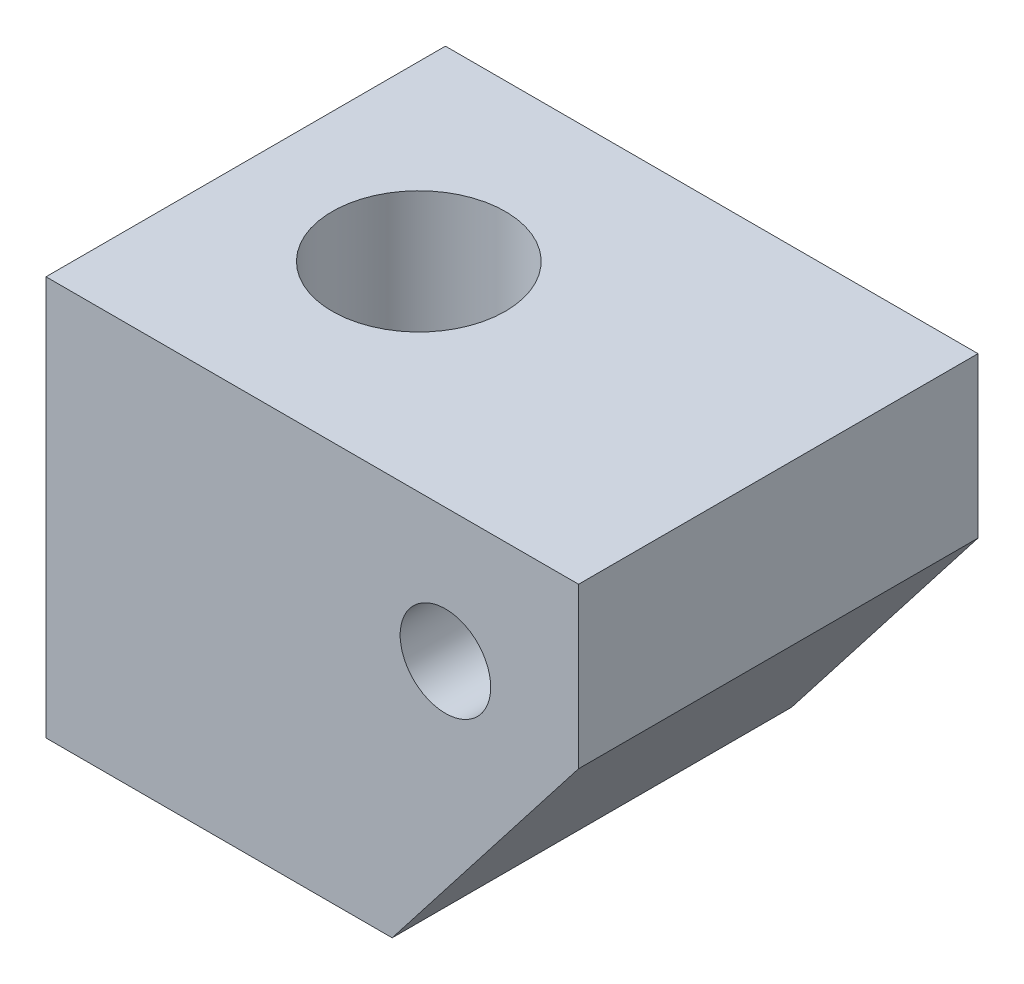
ISO-10303-21;
HEADER;
FILE_DESCRIPTION(('STEP AP214'),'2;1');
FILE_NAME('part.step','',(''),(''),'','','');
FILE_SCHEMA(('AUTOMOTIVE_DESIGN { 1 0 10303 214 1 1 1 1 }'));
ENDSEC;
DATA;
#1=APPLICATION_CONTEXT('core data for automotive mechanical design processes');
#2=APPLICATION_PROTOCOL_DEFINITION('international standard','automotive_design',2000,#1);
#3=PRODUCT_CONTEXT('',#1,'mechanical');
#4=PRODUCT('Part','Part','',(#3));
#5=PRODUCT_RELATED_PRODUCT_CATEGORY('part','',(#4));
#6=PRODUCT_DEFINITION_FORMATION('','',#4);
#7=PRODUCT_DEFINITION_CONTEXT('part definition',#1,'design');
#8=PRODUCT_DEFINITION('design','',#6,#7);
#9=PRODUCT_DEFINITION_SHAPE('','',#8);
#10=(LENGTH_UNIT() NAMED_UNIT(*) SI_UNIT(.MILLI.,.METRE.));
#11=(NAMED_UNIT(*) PLANE_ANGLE_UNIT() SI_UNIT($,.RADIAN.));
#12=(NAMED_UNIT(*) SI_UNIT($,.STERADIAN.) SOLID_ANGLE_UNIT());
#13=UNCERTAINTY_MEASURE_WITH_UNIT(LENGTH_MEASURE(1.E-05),#10,'distance_accuracy_value','');
#14=(GEOMETRIC_REPRESENTATION_CONTEXT(3) GLOBAL_UNCERTAINTY_ASSIGNED_CONTEXT((#13)) GLOBAL_UNIT_ASSIGNED_CONTEXT((#10,
#11,#12)) REPRESENTATION_CONTEXT('',''));
#15=CARTESIAN_POINT('',(0.,0.,0.));
#16=DIRECTION('',(0.,0.,1.));
#17=DIRECTION('',(1.,0.,0.));
#18=AXIS2_PLACEMENT_3D('',#15,#16,#17);
#19=CARTESIAN_POINT('',(7.,9.,15.));
#20=DIRECTION('',(-0.789352217376326,0.613940613514921,0.));
#21=DIRECTION('',(-0.613940613514921,-0.789352217376326,0.));
#22=AXIS2_PLACEMENT_3D('',#19,#20,#21);
#23=PLANE('',#22);
#24=DIRECTION('',(0.613940613514921,0.789352217376326,0.));
#25=VECTOR('',#24,1.);
#26=CARTESIAN_POINT('',(7.,9.,0.));
#27=LINE('',#26,#25);
#28=CARTESIAN_POINT('',(0.,0.,0.));
#29=VERTEX_POINT('',#28);
#30=CARTESIAN_POINT('',(7.,9.,0.));
#31=VERTEX_POINT('',#30);
#32=EDGE_CURVE('E107',#29,#31,#27,.T.);
#33=ORIENTED_EDGE('',*,*,#32,.T.);
#34=DIRECTION('',(0.,0.,-1.));
#35=VECTOR('',#34,1.);
#36=CARTESIAN_POINT('',(7.,9.,15.));
#37=LINE('',#36,#35);
#38=CARTESIAN_POINT('',(7.,9.,15.));
#39=VERTEX_POINT('',#38);
#40=EDGE_CURVE('E11',#39,#31,#37,.T.);
#41=ORIENTED_EDGE('',*,*,#40,.F.);
#42=DIRECTION('',(0.613940613514921,0.789352217376326,0.));
#43=VECTOR('',#42,1.);
#44=CARTESIAN_POINT('',(7.,9.,15.));
#45=LINE('',#44,#43);
#46=CARTESIAN_POINT('',(0.,0.,15.));
#47=VERTEX_POINT('',#46);
#48=EDGE_CURVE('E116',#47,#39,#45,.T.);
#49=ORIENTED_EDGE('',*,*,#48,.F.);
#50=DIRECTION('',(0.,0.,-1.));
#51=VECTOR('',#50,1.);
#52=CARTESIAN_POINT('',(0.,0.,15.));
#53=LINE('',#52,#51);
#54=EDGE_CURVE('E103',#47,#29,#53,.T.);
#55=ORIENTED_EDGE('',*,*,#54,.T.);
#56=EDGE_LOOP('',(#33,#41,#49,#55));
#57=FACE_BOUND('',#56,.T.);
#58=ADVANCED_FACE('F33',(#57),#23,.F.);
#59=CARTESIAN_POINT('',(7.,15.,15.));
#60=DIRECTION('',(-1.,0.,0.));
#61=DIRECTION('',(0.,-1.,0.));
#62=AXIS2_PLACEMENT_3D('',#59,#60,#61);
#63=PLANE('',#62);
#64=DIRECTION('',(0.,1.,0.));
#65=VECTOR('',#64,1.);
#66=CARTESIAN_POINT('',(7.,15.,0.));
#67=LINE('',#66,#65);
#68=CARTESIAN_POINT('',(7.,15.,0.));
#69=VERTEX_POINT('',#68);
#70=EDGE_CURVE('E110',#31,#69,#67,.T.);
#71=ORIENTED_EDGE('',*,*,#70,.T.);
#72=DIRECTION('',(0.,0.,-1.));
#73=VECTOR('',#72,1.);
#74=CARTESIAN_POINT('',(7.,15.,15.));
#75=LINE('',#74,#73);
#76=CARTESIAN_POINT('',(7.,15.,15.));
#77=VERTEX_POINT('',#76);
#78=EDGE_CURVE('E41',#77,#69,#75,.T.);
#79=ORIENTED_EDGE('',*,*,#78,.F.);
#80=DIRECTION('',(0.,1.,0.));
#81=VECTOR('',#80,1.);
#82=CARTESIAN_POINT('',(7.,15.,15.));
#83=LINE('',#82,#81);
#84=EDGE_CURVE('E83',#39,#77,#83,.T.);
#85=ORIENTED_EDGE('',*,*,#84,.F.);
#86=ORIENTED_EDGE('',*,*,#40,.T.);
#87=EDGE_LOOP('',(#71,#79,#85,#86));
#88=FACE_BOUND('',#87,.T.);
#89=ADVANCED_FACE('F140',(#88),#63,.F.);
#90=CARTESIAN_POINT('',(-13.,15.,15.));
#91=DIRECTION('',(0.,-1.,0.));
#92=DIRECTION('',(1.,0.,0.));
#93=AXIS2_PLACEMENT_3D('',#90,#91,#92);
#94=PLANE('',#93);
#95=CARTESIAN_POINT('',(-6.5,15.,7.5));
#96=DIRECTION('',(0.,-1.,0.));
#97=DIRECTION('',(1.,0.,0.));
#98=AXIS2_PLACEMENT_3D('',#95,#96,#97);
#99=CIRCLE('',#98,3.25);
#100=CARTESIAN_POINT('',(-3.25,15.,7.5));
#101=VERTEX_POINT('',#100);
#102=EDGE_CURVE('E153',#101,#101,#99,.T.);
#103=ORIENTED_EDGE('',*,*,#102,.T.);
#104=EDGE_LOOP('',(#103));
#105=FACE_BOUND('',#104,.T.);
#106=DIRECTION('',(-1.,0.,0.));
#107=VECTOR('',#106,1.);
#108=CARTESIAN_POINT('',(-13.,15.,0.));
#109=LINE('',#108,#107);
#110=CARTESIAN_POINT('',(-13.,15.,0.));
#111=VERTEX_POINT('',#110);
#112=EDGE_CURVE('E98',#69,#111,#109,.T.);
#113=ORIENTED_EDGE('',*,*,#112,.T.);
#114=DIRECTION('',(0.,0.,-1.));
#115=VECTOR('',#114,1.);
#116=CARTESIAN_POINT('',(-13.,15.,15.));
#117=LINE('',#116,#115);
#118=CARTESIAN_POINT('',(-13.,15.,15.));
#119=VERTEX_POINT('',#118);
#120=EDGE_CURVE('E95',#119,#111,#117,.T.);
#121=ORIENTED_EDGE('',*,*,#120,.F.);
#122=DIRECTION('',(-1.,0.,0.));
#123=VECTOR('',#122,1.);
#124=CARTESIAN_POINT('',(-13.,15.,15.));
#125=LINE('',#124,#123);
#126=EDGE_CURVE('E87',#77,#119,#125,.T.);
#127=ORIENTED_EDGE('',*,*,#126,.F.);
#128=ORIENTED_EDGE('',*,*,#78,.T.);
#129=EDGE_LOOP('',(#113,#121,#127,#128));
#130=FACE_BOUND('',#129,.T.);
#131=ADVANCED_FACE('F96',(#105,#130),#94,.F.);
#132=CARTESIAN_POINT('',(-13.,0.,15.));
#133=DIRECTION('',(1.,0.,0.));
#134=DIRECTION('',(0.,0.,-1.));
#135=AXIS2_PLACEMENT_3D('',#132,#133,#134);
#136=PLANE('',#135);
#137=DIRECTION('',(0.,-1.,0.));
#138=VECTOR('',#137,1.);
#139=CARTESIAN_POINT('',(-13.,0.,0.));
#140=LINE('',#139,#138);
#141=CARTESIAN_POINT('',(-13.,0.,0.));
#142=VERTEX_POINT('',#141);
#143=EDGE_CURVE('E69',#111,#142,#140,.T.);
#144=ORIENTED_EDGE('',*,*,#143,.T.);
#145=DIRECTION('',(0.,0.,-1.));
#146=VECTOR('',#145,1.);
#147=CARTESIAN_POINT('',(-13.,0.,15.));
#148=LINE('',#147,#146);
#149=CARTESIAN_POINT('',(-13.,0.,15.));
#150=VERTEX_POINT('',#149);
#151=EDGE_CURVE('E99',#150,#142,#148,.T.);
#152=ORIENTED_EDGE('',*,*,#151,.F.);
#153=DIRECTION('',(0.,-1.,0.));
#154=VECTOR('',#153,1.);
#155=CARTESIAN_POINT('',(-13.,0.,15.));
#156=LINE('',#155,#154);
#157=EDGE_CURVE('E91',#119,#150,#156,.T.);
#158=ORIENTED_EDGE('',*,*,#157,.F.);
#159=ORIENTED_EDGE('',*,*,#120,.T.);
#160=EDGE_LOOP('',(#144,#152,#158,#159));
#161=FACE_BOUND('',#160,.T.);
#162=ADVANCED_FACE('F101',(#161),#136,.F.);
#163=CARTESIAN_POINT('',(0.,0.,15.));
#164=DIRECTION('',(0.,1.,0.));
#165=DIRECTION('',(-1.,0.,0.));
#166=AXIS2_PLACEMENT_3D('',#163,#164,#165);
#167=PLANE('',#166);
#168=CARTESIAN_POINT('',(-6.5,0.,7.5));
#169=DIRECTION('',(0.,-1.,0.));
#170=DIRECTION('',(1.,0.,0.));
#171=AXIS2_PLACEMENT_3D('',#168,#169,#170);
#172=CIRCLE('',#171,3.25);
#173=CARTESIAN_POINT('',(-3.25,0.,7.5));
#174=VERTEX_POINT('',#173);
#175=EDGE_CURVE('E156',#174,#174,#172,.T.);
#176=ORIENTED_EDGE('',*,*,#175,.F.);
#177=EDGE_LOOP('',(#176));
#178=FACE_BOUND('',#177,.T.);
#179=DIRECTION('',(1.,0.,0.));
#180=VECTOR('',#179,1.);
#181=CARTESIAN_POINT('',(0.,0.,0.));
#182=LINE('',#181,#180);
#183=EDGE_CURVE('E75',#142,#29,#182,.T.);
#184=ORIENTED_EDGE('',*,*,#183,.T.);
#185=ORIENTED_EDGE('',*,*,#54,.F.);
#186=DIRECTION('',(1.,0.,0.));
#187=VECTOR('',#186,1.);
#188=CARTESIAN_POINT('',(0.,0.,15.));
#189=LINE('',#188,#187);
#190=EDGE_CURVE('E49',#150,#47,#189,.T.);
#191=ORIENTED_EDGE('',*,*,#190,.F.);
#192=ORIENTED_EDGE('',*,*,#151,.T.);
#193=EDGE_LOOP('',(#184,#185,#191,#192));
#194=FACE_BOUND('',#193,.T.);
#195=ADVANCED_FACE('F124',(#178,#194),#167,.F.);
#196=CARTESIAN_POINT('',(0.,0.,15.));
#197=DIRECTION('',(0.,0.,-1.));
#198=DIRECTION('',(-1.,0.,0.));
#199=AXIS2_PLACEMENT_3D('',#196,#197,#198);
#200=PLANE('',#199);
#201=CARTESIAN_POINT('',(2.,9.99999999999999,15.));
#202=DIRECTION('',(0.,0.,1.));
#203=DIRECTION('',(1.,0.,0.));
#204=AXIS2_PLACEMENT_3D('',#201,#202,#203);
#205=CIRCLE('',#204,1.69999999999999);
#206=CARTESIAN_POINT('',(3.69999999999999,9.99999999999999,15.));
#207=VERTEX_POINT('',#206);
#208=EDGE_CURVE('E155',#207,#207,#205,.T.);
#209=ORIENTED_EDGE('',*,*,#208,.F.);
#210=EDGE_LOOP('',(#209));
#211=FACE_BOUND('',#210,.T.);
#212=ORIENTED_EDGE('',*,*,#48,.T.);
#213=ORIENTED_EDGE('',*,*,#84,.T.);
#214=ORIENTED_EDGE('',*,*,#126,.T.);
#215=ORIENTED_EDGE('',*,*,#157,.T.);
#216=ORIENTED_EDGE('',*,*,#190,.T.);
#217=EDGE_LOOP('',(#212,#213,#214,#215,#216));
#218=FACE_BOUND('',#217,.T.);
#219=ADVANCED_FACE('F89',(#211,#218),#200,.F.);
#220=CARTESIAN_POINT('',(0.,0.,0.));
#221=DIRECTION('',(0.,0.,-1.));
#222=DIRECTION('',(-1.,0.,0.));
#223=AXIS2_PLACEMENT_3D('',#220,#221,#222);
#224=PLANE('',#223);
#225=CARTESIAN_POINT('',(2.,9.99999999999999,0.));
#226=DIRECTION('',(0.,0.,1.));
#227=DIRECTION('',(1.,0.,0.));
#228=AXIS2_PLACEMENT_3D('',#225,#226,#227);
#229=CIRCLE('',#228,1.7);
#230=CARTESIAN_POINT('',(3.7,9.99999999999999,0.));
#231=VERTEX_POINT('',#230);
#232=EDGE_CURVE('E111',#231,#231,#229,.T.);
#233=ORIENTED_EDGE('',*,*,#232,.T.);
#234=EDGE_LOOP('',(#233));
#235=FACE_BOUND('',#234,.T.);
#236=ORIENTED_EDGE('',*,*,#32,.F.);
#237=ORIENTED_EDGE('',*,*,#183,.F.);
#238=ORIENTED_EDGE('',*,*,#143,.F.);
#239=ORIENTED_EDGE('',*,*,#112,.F.);
#240=ORIENTED_EDGE('',*,*,#70,.F.);
#241=EDGE_LOOP('',(#236,#237,#238,#239,#240));
#242=FACE_BOUND('',#241,.T.);
#243=ADVANCED_FACE('F120',(#235,#242),#224,.T.);
#244=CARTESIAN_POINT('',(2.,9.99999999999999,15.));
#245=DIRECTION('',(0.,0.,1.));
#246=DIRECTION('',(1.,0.,0.));
#247=AXIS2_PLACEMENT_3D('',#244,#245,#246);
#248=CYLINDRICAL_SURFACE('',#247,1.69999999999999);
#249=ORIENTED_EDGE('',*,*,#232,.F.);
#250=EDGE_LOOP('',(#249));
#251=FACE_BOUND('',#250,.T.);
#252=ORIENTED_EDGE('',*,*,#208,.T.);
#253=EDGE_LOOP('',(#252));
#254=FACE_BOUND('',#253,.T.);
#255=ADVANCED_FACE('F168',(#251,#254),#248,.F.);
#256=CARTESIAN_POINT('',(-6.5,15.,7.5));
#257=DIRECTION('',(0.,-1.,0.));
#258=DIRECTION('',(1.,0.,0.));
#259=AXIS2_PLACEMENT_3D('',#256,#257,#258);
#260=CYLINDRICAL_SURFACE('',#259,3.25);
#261=ORIENTED_EDGE('',*,*,#102,.F.);
#262=EDGE_LOOP('',(#261));
#263=FACE_BOUND('',#262,.T.);
#264=ORIENTED_EDGE('',*,*,#175,.T.);
#265=EDGE_LOOP('',(#264));
#266=FACE_BOUND('',#265,.T.);
#267=ADVANCED_FACE('F171',(#263,#266),#260,.F.);
#268=CLOSED_SHELL('',(#58,#89,#131,#162,#195,#219,#243,#255,#267));
#269=MANIFOLD_SOLID_BREP('B2',#268);
#270=ADVANCED_BREP_SHAPE_REPRESENTATION('',(#18,#269),#14);
#271=SHAPE_DEFINITION_REPRESENTATION(#9,#270);
ENDSEC;
END-ISO-10303-21;
